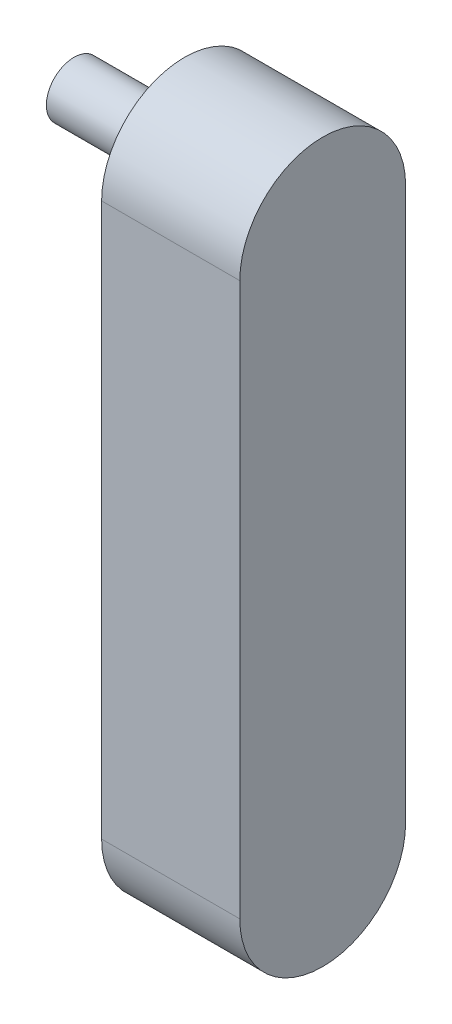
ISO-10303-21;
HEADER;
FILE_DESCRIPTION(('STEP AP214'),'2;1');
FILE_NAME('part.step','',(''),(''),'','','');
FILE_SCHEMA(('AUTOMOTIVE_DESIGN { 1 0 10303 214 1 1 1 1 }'));
ENDSEC;
DATA;
#1=APPLICATION_CONTEXT('core data for automotive mechanical design processes');
#2=APPLICATION_PROTOCOL_DEFINITION('international standard','automotive_design',2000,#1);
#3=PRODUCT_CONTEXT('',#1,'mechanical');
#4=PRODUCT('Part','Part','',(#3));
#5=PRODUCT_RELATED_PRODUCT_CATEGORY('part','',(#4));
#6=PRODUCT_DEFINITION_FORMATION('','',#4);
#7=PRODUCT_DEFINITION_CONTEXT('part definition',#1,'design');
#8=PRODUCT_DEFINITION('design','',#6,#7);
#9=PRODUCT_DEFINITION_SHAPE('','',#8);
#10=(LENGTH_UNIT() NAMED_UNIT(*) SI_UNIT(.MILLI.,.METRE.));
#11=(NAMED_UNIT(*) PLANE_ANGLE_UNIT() SI_UNIT($,.RADIAN.));
#12=(NAMED_UNIT(*) SI_UNIT($,.STERADIAN.) SOLID_ANGLE_UNIT());
#13=UNCERTAINTY_MEASURE_WITH_UNIT(LENGTH_MEASURE(1.E-05),#10,'distance_accuracy_value','');
#14=(GEOMETRIC_REPRESENTATION_CONTEXT(3) GLOBAL_UNCERTAINTY_ASSIGNED_CONTEXT((#13)) GLOBAL_UNIT_ASSIGNED_CONTEXT((#10,
#11,#12)) REPRESENTATION_CONTEXT('',''));
#15=CARTESIAN_POINT('',(0.,0.,0.));
#16=DIRECTION('',(0.,0.,1.));
#17=DIRECTION('',(1.,0.,0.));
#18=AXIS2_PLACEMENT_3D('',#15,#16,#17);
#19=CARTESIAN_POINT('',(63.5,127.,0.));
#20=DIRECTION('',(-1.,0.,0.));
#21=DIRECTION('',(0.,0.,1.));
#22=AXIS2_PLACEMENT_3D('',#19,#20,#21);
#23=CYLINDRICAL_SURFACE('',#22,38.1);
#24=CARTESIAN_POINT('',(0.,127.,0.));
#25=DIRECTION('',(1.,0.,0.));
#26=DIRECTION('',(0.,0.,-1.));
#27=AXIS2_PLACEMENT_3D('',#24,#25,#26);
#28=CIRCLE('',#27,38.1);
#29=CARTESIAN_POINT('',(0.,127.,-38.0999999999999));
#30=VERTEX_POINT('',#29);
#31=CARTESIAN_POINT('',(0.,127.,38.1));
#32=VERTEX_POINT('',#31);
#33=EDGE_CURVE('E102',#30,#32,#28,.T.);
#34=ORIENTED_EDGE('',*,*,#33,.T.);
#35=DIRECTION('',(-1.,0.,0.));
#36=VECTOR('',#35,1.);
#37=CARTESIAN_POINT('',(63.5,127.,38.1));
#38=LINE('',#37,#36);
#39=CARTESIAN_POINT('',(63.5,127.,38.1));
#40=VERTEX_POINT('',#39);
#41=EDGE_CURVE('E11',#40,#32,#38,.T.);
#42=ORIENTED_EDGE('',*,*,#41,.F.);
#43=CARTESIAN_POINT('',(63.5,127.,0.));
#44=DIRECTION('',(1.,0.,0.));
#45=DIRECTION('',(0.,0.,-1.));
#46=AXIS2_PLACEMENT_3D('',#43,#44,#45);
#47=CIRCLE('',#46,38.1);
#48=CARTESIAN_POINT('',(63.5,127.,-38.0999999999999));
#49=VERTEX_POINT('',#48);
#50=EDGE_CURVE('E89',#49,#40,#47,.T.);
#51=ORIENTED_EDGE('',*,*,#50,.F.);
#52=DIRECTION('',(-1.,0.,0.));
#53=VECTOR('',#52,1.);
#54=CARTESIAN_POINT('',(63.5,127.,-38.0999999999999));
#55=LINE('',#54,#53);
#56=EDGE_CURVE('E60',#49,#30,#55,.T.);
#57=ORIENTED_EDGE('',*,*,#56,.T.);
#58=EDGE_LOOP('',(#34,#42,#51,#57));
#59=FACE_BOUND('',#58,.T.);
#60=ADVANCED_FACE('F41',(#59),#23,.T.);
#61=CARTESIAN_POINT('',(63.5,127.,38.1));
#62=DIRECTION('',(0.,0.,-1.));
#63=DIRECTION('',(0.,1.,0.));
#64=AXIS2_PLACEMENT_3D('',#61,#62,#63);
#65=PLANE('',#64);
#66=DIRECTION('',(0.,-1.,0.));
#67=VECTOR('',#66,1.);
#68=CARTESIAN_POINT('',(0.,127.,38.1));
#69=LINE('',#68,#67);
#70=CARTESIAN_POINT('',(0.,-127.,38.0999999999999));
#71=VERTEX_POINT('',#70);
#72=EDGE_CURVE('E92',#32,#71,#69,.T.);
#73=ORIENTED_EDGE('',*,*,#72,.T.);
#74=DIRECTION('',(-1.,0.,0.));
#75=VECTOR('',#74,1.);
#76=CARTESIAN_POINT('',(63.5,-127.,38.0999999999999));
#77=LINE('',#76,#75);
#78=CARTESIAN_POINT('',(63.5,-127.,38.0999999999999));
#79=VERTEX_POINT('',#78);
#80=EDGE_CURVE('E47',#79,#71,#77,.T.);
#81=ORIENTED_EDGE('',*,*,#80,.F.);
#82=DIRECTION('',(0.,-1.,0.));
#83=VECTOR('',#82,1.);
#84=CARTESIAN_POINT('',(63.5,127.,38.1));
#85=LINE('',#84,#83);
#86=EDGE_CURVE('E85',#40,#79,#85,.T.);
#87=ORIENTED_EDGE('',*,*,#86,.F.);
#88=ORIENTED_EDGE('',*,*,#41,.T.);
#89=EDGE_LOOP('',(#73,#81,#87,#88));
#90=FACE_BOUND('',#89,.T.);
#91=ADVANCED_FACE('F94',(#90),#65,.F.);
#92=CARTESIAN_POINT('',(63.5,-127.,0.));
#93=DIRECTION('',(-1.,0.,0.));
#94=DIRECTION('',(0.,0.,1.));
#95=AXIS2_PLACEMENT_3D('',#92,#93,#94);
#96=CYLINDRICAL_SURFACE('',#95,38.1);
#97=CARTESIAN_POINT('',(0.,-127.,0.));
#98=DIRECTION('',(1.,0.,0.));
#99=DIRECTION('',(0.,0.,-1.));
#100=AXIS2_PLACEMENT_3D('',#97,#98,#99);
#101=CIRCLE('',#100,38.1);
#102=CARTESIAN_POINT('',(0.,-127.,-38.1));
#103=VERTEX_POINT('',#102);
#104=EDGE_CURVE('E107',#71,#103,#101,.T.);
#105=ORIENTED_EDGE('',*,*,#104,.T.);
#106=DIRECTION('',(-1.,0.,0.));
#107=VECTOR('',#106,1.);
#108=CARTESIAN_POINT('',(63.5,-127.,-38.1));
#109=LINE('',#108,#107);
#110=CARTESIAN_POINT('',(63.5,-127.,-38.1));
#111=VERTEX_POINT('',#110);
#112=EDGE_CURVE('E75',#111,#103,#109,.T.);
#113=ORIENTED_EDGE('',*,*,#112,.F.);
#114=CARTESIAN_POINT('',(63.5,-127.,0.));
#115=DIRECTION('',(1.,0.,0.));
#116=DIRECTION('',(0.,0.,-1.));
#117=AXIS2_PLACEMENT_3D('',#114,#115,#116);
#118=CIRCLE('',#117,38.1);
#119=EDGE_CURVE('E90',#79,#111,#118,.T.);
#120=ORIENTED_EDGE('',*,*,#119,.F.);
#121=ORIENTED_EDGE('',*,*,#80,.T.);
#122=EDGE_LOOP('',(#105,#113,#120,#121));
#123=FACE_BOUND('',#122,.T.);
#124=ADVANCED_FACE('F98',(#123),#96,.T.);
#125=CARTESIAN_POINT('',(63.5,127.,-38.0999999999999));
#126=DIRECTION('',(0.,0.,-1.));
#127=DIRECTION('',(0.,1.,0.));
#128=AXIS2_PLACEMENT_3D('',#125,#126,#127);
#129=PLANE('',#128);
#130=DIRECTION('',(0.,-1.,0.));
#131=VECTOR('',#130,1.);
#132=CARTESIAN_POINT('',(0.,127.,-38.0999999999999));
#133=LINE('',#132,#131);
#134=EDGE_CURVE('E109',#30,#103,#133,.T.);
#135=ORIENTED_EDGE('',*,*,#134,.F.);
#136=ORIENTED_EDGE('',*,*,#56,.F.);
#137=DIRECTION('',(0.,-1.,0.));
#138=VECTOR('',#137,1.);
#139=CARTESIAN_POINT('',(63.5,127.,-38.0999999999999));
#140=LINE('',#139,#138);
#141=EDGE_CURVE('E97',#49,#111,#140,.T.);
#142=ORIENTED_EDGE('',*,*,#141,.T.);
#143=ORIENTED_EDGE('',*,*,#112,.T.);
#144=EDGE_LOOP('',(#135,#136,#142,#143));
#145=FACE_BOUND('',#144,.T.);
#146=ADVANCED_FACE('F145',(#145),#129,.T.);
#147=CARTESIAN_POINT('',(63.5,127.,0.));
#148=DIRECTION('',(1.,0.,0.));
#149=DIRECTION('',(0.,0.,-1.));
#150=AXIS2_PLACEMENT_3D('',#147,#148,#149);
#151=PLANE('',#150);
#152=ORIENTED_EDGE('',*,*,#50,.T.);
#153=ORIENTED_EDGE('',*,*,#86,.T.);
#154=ORIENTED_EDGE('',*,*,#119,.T.);
#155=ORIENTED_EDGE('',*,*,#141,.F.);
#156=EDGE_LOOP('',(#152,#153,#154,#155));
#157=FACE_BOUND('',#156,.T.);
#158=ADVANCED_FACE('F88',(#157),#151,.T.);
#159=CARTESIAN_POINT('',(0.,127.,0.));
#160=DIRECTION('',(1.,0.,0.));
#161=DIRECTION('',(0.,0.,-1.));
#162=AXIS2_PLACEMENT_3D('',#159,#160,#161);
#163=PLANE('',#162);
#164=CARTESIAN_POINT('',(0.,127.,0.));
#165=DIRECTION('',(1.,0.,0.));
#166=DIRECTION('',(0.,0.,-1.));
#167=AXIS2_PLACEMENT_3D('',#164,#165,#166);
#168=CIRCLE('',#167,12.7);
#169=CARTESIAN_POINT('',(0.,127.,-12.6999999999999));
#170=VERTEX_POINT('',#169);
#171=EDGE_CURVE('E124',#170,#170,#168,.T.);
#172=ORIENTED_EDGE('',*,*,#171,.T.);
#173=EDGE_LOOP('',(#172));
#174=FACE_BOUND('',#173,.T.);
#175=CARTESIAN_POINT('',(0.,-127.,0.));
#176=DIRECTION('',(1.,0.,0.));
#177=DIRECTION('',(0.,0.,-1.));
#178=AXIS2_PLACEMENT_3D('',#175,#176,#177);
#179=CIRCLE('',#178,13.97);
#180=CARTESIAN_POINT('',(0.,-127.,13.97));
#181=VERTEX_POINT('',#180);
#182=EDGE_CURVE('E117',#181,#181,#179,.T.);
#183=ORIENTED_EDGE('',*,*,#182,.T.);
#184=EDGE_LOOP('',(#183));
#185=FACE_BOUND('',#184,.T.);
#186=ORIENTED_EDGE('',*,*,#33,.F.);
#187=ORIENTED_EDGE('',*,*,#134,.T.);
#188=ORIENTED_EDGE('',*,*,#104,.F.);
#189=ORIENTED_EDGE('',*,*,#72,.F.);
#190=EDGE_LOOP('',(#186,#187,#188,#189));
#191=FACE_BOUND('',#190,.T.);
#192=ADVANCED_FACE('F141',(#174,#185,#191),#163,.F.);
#193=CARTESIAN_POINT('',(48.26,-127.,0.));
#194=DIRECTION('',(-1.,0.,0.));
#195=DIRECTION('',(0.,0.,1.));
#196=AXIS2_PLACEMENT_3D('',#193,#194,#195);
#197=CYLINDRICAL_SURFACE('',#196,13.97);
#198=CARTESIAN_POINT('',(48.26,-127.,0.));
#199=DIRECTION('',(1.,0.,0.));
#200=DIRECTION('',(0.,0.,-1.));
#201=AXIS2_PLACEMENT_3D('',#198,#199,#200);
#202=CIRCLE('',#201,13.97);
#203=CARTESIAN_POINT('',(48.26,-127.,13.97));
#204=VERTEX_POINT('',#203);
#205=EDGE_CURVE('E106',#204,#204,#202,.T.);
#206=CARTESIAN_POINT('',(48.26,-127.,13.97));
#207=CARTESIAN_POINT('',(47.7572916666667,-127.,13.97));
#208=CARTESIAN_POINT('',(47.2545833333333,-127.,13.97));
#209=CARTESIAN_POINT('',(46.2491666666667,-127.,13.97));
#210=CARTESIAN_POINT('',(45.7464583333333,-127.,13.97));
#211=CARTESIAN_POINT('',(44.7410416666667,-127.,13.97));
#212=CARTESIAN_POINT('',(44.2383333333333,-127.,13.97));
#213=CARTESIAN_POINT('',(43.2329166666667,-127.,13.97));
#214=CARTESIAN_POINT('',(42.7302083333333,-127.,13.97));
#215=CARTESIAN_POINT('',(41.7247916666667,-127.,13.97));
#216=CARTESIAN_POINT('',(41.2220833333333,-127.,13.97));
#217=CARTESIAN_POINT('',(40.2166666666667,-127.,13.97));
#218=CARTESIAN_POINT('',(39.7139583333333,-127.,13.97));
#219=CARTESIAN_POINT('',(38.7085416666667,-127.,13.97));
#220=CARTESIAN_POINT('',(38.2058333333333,-127.,13.97));
#221=CARTESIAN_POINT('',(37.2004166666667,-127.,13.97));
#222=CARTESIAN_POINT('',(36.6977083333333,-127.,13.97));
#223=CARTESIAN_POINT('',(35.6922916666667,-127.,13.97));
#224=CARTESIAN_POINT('',(35.1895833333333,-127.,13.97));
#225=CARTESIAN_POINT('',(34.1841666666667,-127.,13.97));
#226=CARTESIAN_POINT('',(33.6814583333333,-127.,13.97));
#227=CARTESIAN_POINT('',(32.6760416666667,-127.,13.97));
#228=CARTESIAN_POINT('',(32.1733333333333,-127.,13.97));
#229=CARTESIAN_POINT('',(31.1679166666667,-127.,13.97));
#230=CARTESIAN_POINT('',(30.6652083333333,-127.,13.97));
#231=CARTESIAN_POINT('',(29.6597916666667,-127.,13.97));
#232=CARTESIAN_POINT('',(29.1570833333333,-127.,13.97));
#233=CARTESIAN_POINT('',(28.1516666666667,-127.,13.97));
#234=CARTESIAN_POINT('',(27.6489583333333,-127.,13.97));
#235=CARTESIAN_POINT('',(26.6435416666667,-127.,13.97));
#236=CARTESIAN_POINT('',(26.1408333333333,-127.,13.97));
#237=CARTESIAN_POINT('',(25.1354166666667,-127.,13.97));
#238=CARTESIAN_POINT('',(24.6327083333333,-127.,13.97));
#239=CARTESIAN_POINT('',(23.6272916666667,-127.,13.97));
#240=CARTESIAN_POINT('',(23.1245833333333,-127.,13.97));
#241=CARTESIAN_POINT('',(22.1191666666667,-127.,13.97));
#242=CARTESIAN_POINT('',(21.6164583333333,-127.,13.97));
#243=CARTESIAN_POINT('',(20.6110416666667,-127.,13.97));
#244=CARTESIAN_POINT('',(20.1083333333333,-127.,13.97));
#245=CARTESIAN_POINT('',(19.1029166666667,-127.,13.97));
#246=CARTESIAN_POINT('',(18.6002083333333,-127.,13.97));
#247=CARTESIAN_POINT('',(17.5947916666667,-127.,13.97));
#248=CARTESIAN_POINT('',(17.0920833333333,-127.,13.97));
#249=CARTESIAN_POINT('',(16.0866666666667,-127.,13.97));
#250=CARTESIAN_POINT('',(15.5839583333333,-127.,13.97));
#251=CARTESIAN_POINT('',(14.5785416666667,-127.,13.97));
#252=CARTESIAN_POINT('',(14.0758333333333,-127.,13.97));
#253=CARTESIAN_POINT('',(13.0704166666667,-127.,13.97));
#254=CARTESIAN_POINT('',(12.5677083333333,-127.,13.97));
#255=CARTESIAN_POINT('',(11.5622916666667,-127.,13.97));
#256=CARTESIAN_POINT('',(11.0595833333333,-127.,13.97));
#257=CARTESIAN_POINT('',(10.0541666666667,-127.,13.97));
#258=CARTESIAN_POINT('',(9.55145833333333,-127.,13.97));
#259=CARTESIAN_POINT('',(8.54604166666666,-127.,13.97));
#260=CARTESIAN_POINT('',(8.04333333333333,-127.,13.97));
#261=CARTESIAN_POINT('',(7.03791666666666,-127.,13.97));
#262=CARTESIAN_POINT('',(6.53520833333333,-127.,13.97));
#263=CARTESIAN_POINT('',(5.52979166666666,-127.,13.97));
#264=CARTESIAN_POINT('',(5.02708333333333,-127.,13.97));
#265=CARTESIAN_POINT('',(4.02166666666666,-127.,13.97));
#266=CARTESIAN_POINT('',(3.51895833333332,-127.,13.97));
#267=CARTESIAN_POINT('',(2.51354166666666,-127.,13.97));
#268=CARTESIAN_POINT('',(2.01083333333333,-127.,13.97));
#269=CARTESIAN_POINT('',(1.00541666666666,-127.,13.97));
#270=CARTESIAN_POINT('',(0.502708333333326,-127.,13.97));
#271=CARTESIAN_POINT('',(0.,-127.,13.97));
#272=B_SPLINE_CURVE_WITH_KNOTS('',3,(#206,#207,#208,#209,#210,#211,#212,#213,#214,#215,#216,
#217,#218,#219,#220,#221,#222,#223,#224,#225,#226,#227,#228,#229,#230,#231,#232,#233,#234,#235,
#236,#237,#238,#239,#240,#241,#242,#243,#244,#245,#246,#247,#248,#249,#250,#251,#252,#253,#254,
#255,#256,#257,#258,#259,#260,#261,#262,#263,#264,#265,#266,#267,#268,#269,#270,#271),
.UNSPECIFIED.,.F.,.F.,(4,2,2,2,2,2,2,2,2,2,2,2,2,2,2,2,2,2,2,2,2,2,2,2,2,2,2,2,2,2,2,2,4),(0.,
1.508125,3.01625,4.524375,6.0325,7.540625,9.04874999999999,10.556875,12.065,13.573125,15.08125,
16.589375,18.0975,19.605625,21.11375,22.621875,24.13,25.638125,27.14625,28.654375,30.1625,
31.670625,33.17875,34.686875,36.195,37.703125,39.21125,40.719375,42.2275,43.735625,45.24375,
46.751875,48.26),.UNSPECIFIED.);
#273=EDGE_CURVE('BSEAM154',#204,#181,#272,.T.);
#274=ORIENTED_EDGE('',*,*,#205,.T.);
#275=ORIENTED_EDGE('',*,*,#182,.F.);
#276=ORIENTED_EDGE('',*,*,#273,.T.);
#277=ORIENTED_EDGE('',*,*,#273,.F.);
#278=EDGE_LOOP('',(#274,#276,#275,#277));
#279=FACE_BOUND('',#278,.T.);
#280=ADVANCED_FACE('F154',(#279),#197,.F.);
#281=CARTESIAN_POINT('',(48.26,-127.,0.));
#282=DIRECTION('',(1.,0.,0.));
#283=DIRECTION('',(0.,0.,-1.));
#284=AXIS2_PLACEMENT_3D('',#281,#282,#283);
#285=PLANE('',#284);
#286=ORIENTED_EDGE('',*,*,#205,.F.);
#287=EDGE_LOOP('',(#286));
#288=FACE_BOUND('',#287,.T.);
#289=ADVANCED_FACE('F139',(#288),#285,.F.);
#290=CARTESIAN_POINT('',(-50.8,127.,0.));
#291=DIRECTION('',(1.,0.,0.));
#292=DIRECTION('',(0.,0.,-1.));
#293=AXIS2_PLACEMENT_3D('',#290,#291,#292);
#294=CYLINDRICAL_SURFACE('',#293,12.7);
#295=CARTESIAN_POINT('',(-50.8,127.,0.));
#296=DIRECTION('',(1.,0.,0.));
#297=DIRECTION('',(0.,0.,-1.));
#298=AXIS2_PLACEMENT_3D('',#295,#296,#297);
#299=CIRCLE('',#298,12.7);
#300=CARTESIAN_POINT('',(-50.8,127.,-12.6999999999999));
#301=VERTEX_POINT('',#300);
#302=EDGE_CURVE('E116',#301,#301,#299,.T.);
#303=ORIENTED_EDGE('',*,*,#302,.T.);
#304=EDGE_LOOP('',(#303));
#305=FACE_BOUND('',#304,.T.);
#306=ORIENTED_EDGE('',*,*,#171,.F.);
#307=EDGE_LOOP('',(#306));
#308=FACE_BOUND('',#307,.T.);
#309=ADVANCED_FACE('F126',(#305,#308),#294,.T.);
#310=CARTESIAN_POINT('',(-50.8,127.,0.));
#311=DIRECTION('',(1.,0.,0.));
#312=DIRECTION('',(0.,0.,-1.));
#313=AXIS2_PLACEMENT_3D('',#310,#311,#312);
#314=PLANE('',#313);
#315=ORIENTED_EDGE('',*,*,#302,.F.);
#316=EDGE_LOOP('',(#315));
#317=FACE_BOUND('',#316,.T.);
#318=ADVANCED_FACE('F132',(#317),#314,.F.);
#319=CLOSED_SHELL('',(#60,#91,#124,#146,#158,#192,#280,#289,#309,#318));
#320=MANIFOLD_SOLID_BREP('B2',#319);
#321=ADVANCED_BREP_SHAPE_REPRESENTATION('',(#18,#320),#14);
#322=SHAPE_DEFINITION_REPRESENTATION(#9,#321);
ENDSEC;
END-ISO-10303-21;
